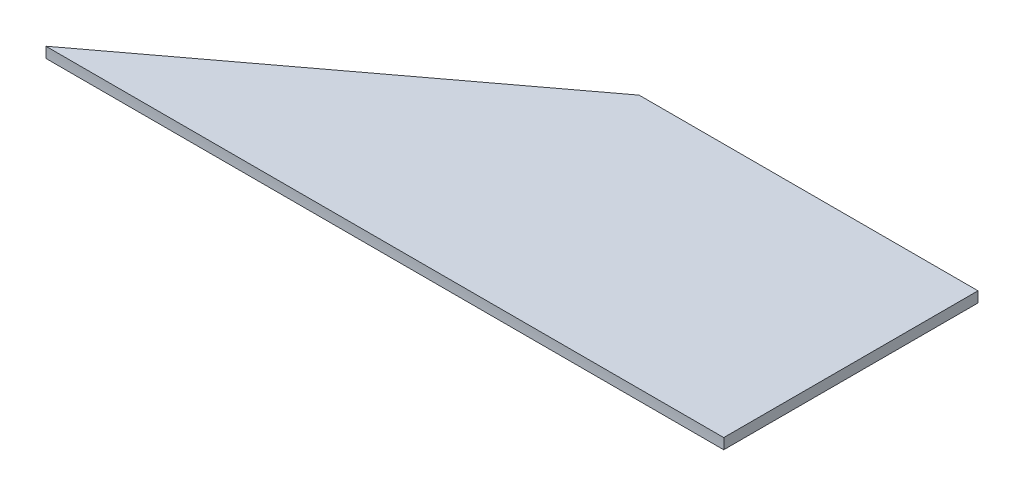
ISO-10303-21;
HEADER;
FILE_DESCRIPTION(('STEP AP214'),'2;1');
FILE_NAME('part.step','',(''),(''),'','','');
FILE_SCHEMA(('AUTOMOTIVE_DESIGN { 1 0 10303 214 1 1 1 1 }'));
ENDSEC;
DATA;
#1=APPLICATION_CONTEXT('core data for automotive mechanical design processes');
#2=APPLICATION_PROTOCOL_DEFINITION('international standard','automotive_design',2000,#1);
#3=PRODUCT_CONTEXT('',#1,'mechanical');
#4=PRODUCT('Part','Part','',(#3));
#5=PRODUCT_RELATED_PRODUCT_CATEGORY('part','',(#4));
#6=PRODUCT_DEFINITION_FORMATION('','',#4);
#7=PRODUCT_DEFINITION_CONTEXT('part definition',#1,'design');
#8=PRODUCT_DEFINITION('design','',#6,#7);
#9=PRODUCT_DEFINITION_SHAPE('','',#8);
#10=(LENGTH_UNIT() NAMED_UNIT(*) SI_UNIT(.MILLI.,.METRE.));
#11=(NAMED_UNIT(*) PLANE_ANGLE_UNIT() SI_UNIT($,.RADIAN.));
#12=(NAMED_UNIT(*) SI_UNIT($,.STERADIAN.) SOLID_ANGLE_UNIT());
#13=UNCERTAINTY_MEASURE_WITH_UNIT(LENGTH_MEASURE(1.E-05),#10,'distance_accuracy_value','');
#14=(GEOMETRIC_REPRESENTATION_CONTEXT(3) GLOBAL_UNCERTAINTY_ASSIGNED_CONTEXT((#13)) GLOBAL_UNIT_ASSIGNED_CONTEXT((#10,
#11,#12)) REPRESENTATION_CONTEXT('',''));
#15=CARTESIAN_POINT('',(0.,0.,0.));
#16=DIRECTION('',(0.,0.,1.));
#17=DIRECTION('',(1.,0.,0.));
#18=AXIS2_PLACEMENT_3D('',#15,#16,#17);
#19=CARTESIAN_POINT('',(101.6,1.5875,-76.2));
#20=DIRECTION('',(-1.,0.,0.));
#21=DIRECTION('',(0.,0.,1.));
#22=AXIS2_PLACEMENT_3D('',#19,#20,#21);
#23=PLANE('',#22);
#24=DIRECTION('',(0.,0.,-1.));
#25=VECTOR('',#24,1.);
#26=CARTESIAN_POINT('',(101.6,-1.5875,-76.2));
#27=LINE('',#26,#25);
#28=CARTESIAN_POINT('',(101.6,-1.5875,0.0318136528178053));
#29=VERTEX_POINT('',#28);
#30=CARTESIAN_POINT('',(101.6,-1.5875,-76.2));
#31=VERTEX_POINT('',#30);
#32=EDGE_CURVE('E142',#29,#31,#27,.T.);
#33=ORIENTED_EDGE('',*,*,#32,.T.);
#34=DIRECTION('',(0.,-1.,0.));
#35=VECTOR('',#34,1.);
#36=CARTESIAN_POINT('',(101.6,1.5875,-76.2));
#37=LINE('',#36,#35);
#38=CARTESIAN_POINT('',(101.6,1.5875,-76.2));
#39=VERTEX_POINT('',#38);
#40=EDGE_CURVE('E12',#39,#31,#37,.T.);
#41=ORIENTED_EDGE('',*,*,#40,.F.);
#42=DIRECTION('',(0.,0.,-1.));
#43=VECTOR('',#42,1.);
#44=CARTESIAN_POINT('',(101.6,1.5875,-76.2));
#45=LINE('',#44,#43);
#46=CARTESIAN_POINT('',(101.6,1.5875,0.0318136528178052));
#47=VERTEX_POINT('',#46);
#48=EDGE_CURVE('E115',#47,#39,#45,.T.);
#49=ORIENTED_EDGE('',*,*,#48,.F.);
#50=CARTESIAN_POINT('',(101.6,0.,39.624));
#51=DIRECTION('',(1.,0.,0.));
#52=DIRECTION('',(0.,0.,-1.));
#53=AXIS2_PLACEMENT_3D('',#50,#51,#52);
#54=CIRCLE('',#53,39.624);
#55=EDGE_CURVE('E133',#29,#47,#54,.T.);
#56=ORIENTED_EDGE('',*,*,#55,.F.);
#57=EDGE_LOOP('',(#33,#41,#49,#56));
#58=FACE_BOUND('',#57,.T.);
#59=ADVANCED_FACE('F65',(#58),#23,.F.);
#60=CARTESIAN_POINT('',(0.,1.5875,-76.2));
#61=DIRECTION('',(0.,0.,1.));
#62=DIRECTION('',(1.,0.,0.));
#63=AXIS2_PLACEMENT_3D('',#60,#61,#62);
#64=PLANE('',#63);
#65=DIRECTION('',(-1.,0.,0.));
#66=VECTOR('',#65,1.);
#67=CARTESIAN_POINT('',(0.,-1.5875,-76.2));
#68=LINE('',#67,#66);
#69=CARTESIAN_POINT('',(0.,-1.5875,-76.2));
#70=VERTEX_POINT('',#69);
#71=EDGE_CURVE('E116',#31,#70,#68,.T.);
#72=ORIENTED_EDGE('',*,*,#71,.T.);
#73=DIRECTION('',(0.,-1.,0.));
#74=VECTOR('',#73,1.);
#75=CARTESIAN_POINT('',(0.,1.5875,-76.2));
#76=LINE('',#75,#74);
#77=CARTESIAN_POINT('',(0.,1.5875,-76.2));
#78=VERTEX_POINT('',#77);
#79=EDGE_CURVE('E73',#78,#70,#76,.T.);
#80=ORIENTED_EDGE('',*,*,#79,.F.);
#81=DIRECTION('',(-1.,0.,0.));
#82=VECTOR('',#81,1.);
#83=CARTESIAN_POINT('',(0.,1.5875,-76.2));
#84=LINE('',#83,#82);
#85=EDGE_CURVE('E89',#39,#78,#84,.T.);
#86=ORIENTED_EDGE('',*,*,#85,.F.);
#87=ORIENTED_EDGE('',*,*,#40,.T.);
#88=EDGE_LOOP('',(#72,#80,#86,#87));
#89=FACE_BOUND('',#88,.T.);
#90=ADVANCED_FACE('F158',(#89),#64,.F.);
#91=CARTESIAN_POINT('',(-101.6,1.5875,0.));
#92=DIRECTION('',(0.6,0.,0.8));
#93=DIRECTION('',(0.8,0.,-0.6));
#94=AXIS2_PLACEMENT_3D('',#91,#92,#93);
#95=PLANE('',#94);
#96=DIRECTION('',(-0.8,0.,0.6));
#97=VECTOR('',#96,1.);
#98=CARTESIAN_POINT('',(-101.6,-1.5875,0.));
#99=LINE('',#98,#97);
#100=CARTESIAN_POINT('',(-101.6,-1.5875,0.));
#101=VERTEX_POINT('',#100);
#102=EDGE_CURVE('E106',#70,#101,#99,.T.);
#103=ORIENTED_EDGE('',*,*,#102,.T.);
#104=DIRECTION('',(0.,-1.,0.));
#105=VECTOR('',#104,1.);
#106=CARTESIAN_POINT('',(-101.6,0.,0.));
#107=LINE('',#106,#105);
#108=CARTESIAN_POINT('',(-101.6,0.,0.));
#109=VERTEX_POINT('',#108);
#110=EDGE_CURVE('E110',#109,#101,#107,.T.);
#111=ORIENTED_EDGE('',*,*,#110,.F.);
#112=DIRECTION('',(0.,-1.,0.));
#113=VECTOR('',#112,1.);
#114=CARTESIAN_POINT('',(-101.6,1.5875,0.));
#115=LINE('',#114,#113);
#116=CARTESIAN_POINT('',(-101.6,1.5875,0.));
#117=VERTEX_POINT('',#116);
#118=EDGE_CURVE('E80',#117,#109,#115,.T.);
#119=ORIENTED_EDGE('',*,*,#118,.F.);
#120=DIRECTION('',(-0.8,0.,0.6));
#121=VECTOR('',#120,1.);
#122=CARTESIAN_POINT('',(-101.6,1.5875,0.));
#123=LINE('',#122,#121);
#124=EDGE_CURVE('E147',#78,#117,#123,.T.);
#125=ORIENTED_EDGE('',*,*,#124,.F.);
#126=ORIENTED_EDGE('',*,*,#79,.T.);
#127=EDGE_LOOP('',(#103,#111,#119,#125,#126));
#128=FACE_BOUND('',#127,.T.);
#129=ADVANCED_FACE('F108',(#128),#95,.F.);
#130=CARTESIAN_POINT('',(0.,1.5875,0.));
#131=DIRECTION('',(0.,1.,0.));
#132=DIRECTION('',(0.,0.,1.));
#133=AXIS2_PLACEMENT_3D('',#130,#131,#132);
#134=PLANE('',#133);
#135=ORIENTED_EDGE('',*,*,#48,.T.);
#136=ORIENTED_EDGE('',*,*,#85,.T.);
#137=ORIENTED_EDGE('',*,*,#124,.T.);
#138=DIRECTION('',(0.,0.,1.));
#139=VECTOR('',#138,1.);
#140=CARTESIAN_POINT('',(-101.6,1.5875,0.));
#141=LINE('',#140,#139);
#142=CARTESIAN_POINT('',(-101.6,1.5875,0.0318136528178052));
#143=VERTEX_POINT('',#142);
#144=EDGE_CURVE('E175',#117,#143,#141,.T.);
#145=ORIENTED_EDGE('',*,*,#144,.T.);
#146=DIRECTION('',(-1.,0.,0.));
#147=VECTOR('',#146,1.);
#148=CARTESIAN_POINT('',(101.6,1.5875,0.0318136528178052));
#149=LINE('',#148,#147);
#150=EDGE_CURVE('E173',#47,#143,#149,.T.);
#151=ORIENTED_EDGE('',*,*,#150,.F.);
#152=EDGE_LOOP('',(#135,#136,#137,#145,#151));
#153=FACE_BOUND('',#152,.T.);
#154=ADVANCED_FACE('F171',(#153),#134,.T.);
#155=CARTESIAN_POINT('',(0.,-1.5875,0.));
#156=DIRECTION('',(0.,1.,0.));
#157=DIRECTION('',(0.,0.,1.));
#158=AXIS2_PLACEMENT_3D('',#155,#156,#157);
#159=PLANE('',#158);
#160=ORIENTED_EDGE('',*,*,#32,.F.);
#161=DIRECTION('',(-1.,0.,0.));
#162=VECTOR('',#161,1.);
#163=CARTESIAN_POINT('',(101.6,-1.5875,0.0318136528178053));
#164=LINE('',#163,#162);
#165=CARTESIAN_POINT('',(-101.6,-1.5875,0.0318136528178053));
#166=VERTEX_POINT('',#165);
#167=EDGE_CURVE('E125',#29,#166,#164,.T.);
#168=ORIENTED_EDGE('',*,*,#167,.T.);
#169=DIRECTION('',(0.,0.,1.));
#170=VECTOR('',#169,1.);
#171=CARTESIAN_POINT('',(-101.6,-1.5875,0.));
#172=LINE('',#171,#170);
#173=EDGE_CURVE('E120',#101,#166,#172,.T.);
#174=ORIENTED_EDGE('',*,*,#173,.F.);
#175=ORIENTED_EDGE('',*,*,#102,.F.);
#176=ORIENTED_EDGE('',*,*,#71,.F.);
#177=EDGE_LOOP('',(#160,#168,#174,#175,#176));
#178=FACE_BOUND('',#177,.T.);
#179=ADVANCED_FACE('F122',(#178),#159,.F.);
#180=CARTESIAN_POINT('',(101.6,0.,39.624));
#181=DIRECTION('',(-1.,0.,0.));
#182=DIRECTION('',(0.,0.,1.));
#183=AXIS2_PLACEMENT_3D('',#180,#181,#182);
#184=CYLINDRICAL_SURFACE('',#183,39.624);
#185=CARTESIAN_POINT('',(-101.6,0.,39.624));
#186=DIRECTION('',(1.,0.,0.));
#187=DIRECTION('',(0.,0.,-1.));
#188=AXIS2_PLACEMENT_3D('',#185,#186,#187);
#189=CIRCLE('',#188,39.624);
#190=EDGE_CURVE('E129',#166,#109,#189,.T.);
#191=ORIENTED_EDGE('',*,*,#190,.F.);
#192=ORIENTED_EDGE('',*,*,#167,.F.);
#193=ORIENTED_EDGE('',*,*,#55,.T.);
#194=ORIENTED_EDGE('',*,*,#150,.T.);
#195=CARTESIAN_POINT('',(-101.6,0.,39.624));
#196=DIRECTION('',(1.,0.,0.));
#197=DIRECTION('',(0.,0.,-1.));
#198=AXIS2_PLACEMENT_3D('',#195,#196,#197);
#199=CIRCLE('',#198,39.624);
#200=EDGE_CURVE('E179',#109,#143,#199,.T.);
#201=ORIENTED_EDGE('',*,*,#200,.F.);
#202=EDGE_LOOP('',(#191,#192,#193,#194,#201));
#203=FACE_BOUND('',#202,.T.);
#204=ADVANCED_FACE('F164',(#203),#184,.F.);
#205=CARTESIAN_POINT('',(-101.6,0.,0.));
#206=DIRECTION('',(1.,0.,0.));
#207=DIRECTION('',(0.,0.,-1.));
#208=AXIS2_PLACEMENT_3D('',#205,#206,#207);
#209=PLANE('',#208);
#210=ORIENTED_EDGE('',*,*,#190,.T.);
#211=ORIENTED_EDGE('',*,*,#110,.T.);
#212=ORIENTED_EDGE('',*,*,#173,.T.);
#213=EDGE_LOOP('',(#210,#211,#212));
#214=FACE_BOUND('',#213,.T.);
#215=ADVANCED_FACE('F131',(#214),#209,.F.);
#216=CARTESIAN_POINT('',(-101.6,0.,0.));
#217=DIRECTION('',(1.,0.,0.));
#218=DIRECTION('',(0.,0.,-1.));
#219=AXIS2_PLACEMENT_3D('',#216,#217,#218);
#220=PLANE('',#219);
#221=ORIENTED_EDGE('',*,*,#200,.T.);
#222=ORIENTED_EDGE('',*,*,#144,.F.);
#223=ORIENTED_EDGE('',*,*,#118,.T.);
#224=EDGE_LOOP('',(#221,#222,#223));
#225=FACE_BOUND('',#224,.T.);
#226=ADVANCED_FACE('F184',(#225),#220,.F.);
#227=CLOSED_SHELL('',(#59,#90,#129,#154,#179,#204,#215,#226));
#228=MANIFOLD_SOLID_BREP('B2',#227);
#229=ADVANCED_BREP_SHAPE_REPRESENTATION('',(#18,#228),#14);
#230=SHAPE_DEFINITION_REPRESENTATION(#9,#229);
ENDSEC;
END-ISO-10303-21;
